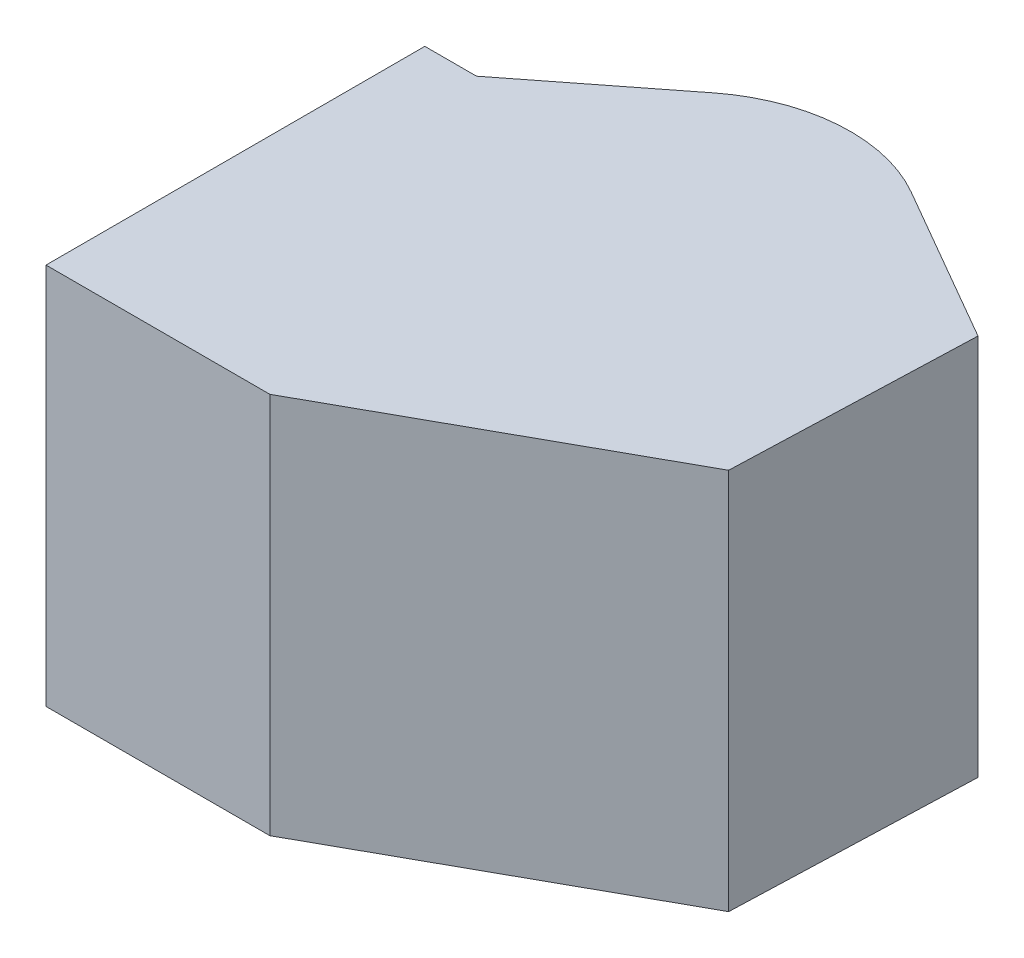
ISO-10303-21;
HEADER;
FILE_DESCRIPTION(('STEP AP214'),'2;1');
FILE_NAME('part.step','',(''),(''),'','','');
FILE_SCHEMA(('AUTOMOTIVE_DESIGN { 1 0 10303 214 1 1 1 1 }'));
ENDSEC;
DATA;
#1=APPLICATION_CONTEXT('core data for automotive mechanical design processes');
#2=APPLICATION_PROTOCOL_DEFINITION('international standard','automotive_design',2000,#1);
#3=PRODUCT_CONTEXT('',#1,'mechanical');
#4=PRODUCT('Part','Part','',(#3));
#5=PRODUCT_RELATED_PRODUCT_CATEGORY('part','',(#4));
#6=PRODUCT_DEFINITION_FORMATION('','',#4);
#7=PRODUCT_DEFINITION_CONTEXT('part definition',#1,'design');
#8=PRODUCT_DEFINITION('design','',#6,#7);
#9=PRODUCT_DEFINITION_SHAPE('','',#8);
#10=(LENGTH_UNIT() NAMED_UNIT(*) SI_UNIT(.MILLI.,.METRE.));
#11=(NAMED_UNIT(*) PLANE_ANGLE_UNIT() SI_UNIT($,.RADIAN.));
#12=(NAMED_UNIT(*) SI_UNIT($,.STERADIAN.) SOLID_ANGLE_UNIT());
#13=UNCERTAINTY_MEASURE_WITH_UNIT(LENGTH_MEASURE(1.E-05),#10,'distance_accuracy_value','');
#14=(GEOMETRIC_REPRESENTATION_CONTEXT(3) GLOBAL_UNCERTAINTY_ASSIGNED_CONTEXT((#13)) GLOBAL_UNIT_ASSIGNED_CONTEXT((#10,
#11,#12)) REPRESENTATION_CONTEXT('',''));
#15=CARTESIAN_POINT('',(0.,0.,0.));
#16=DIRECTION('',(0.,0.,1.));
#17=DIRECTION('',(1.,0.,0.));
#18=AXIS2_PLACEMENT_3D('',#15,#16,#17);
#19=CARTESIAN_POINT('',(-83.2176409176913,-55.5,55.));
#20=DIRECTION('',(-1.,0.,0.));
#21=DIRECTION('',(0.,0.,1.));
#22=AXIS2_PLACEMENT_3D('',#19,#20,#21);
#23=PLANE('',#22);
#24=CARTESIAN_POINT('',(-83.2176409176913,0.,0.));
#25=DIRECTION('',(-1.,0.,0.));
#26=DIRECTION('',(0.,0.,1.));
#27=AXIS2_PLACEMENT_3D('',#24,#25,#26);
#28=CIRCLE('',#27,48.);
#29=CARTESIAN_POINT('',(-83.2176409176913,0.,48.));
#30=VERTEX_POINT('',#29);
#31=EDGE_CURVE('E11',#30,#30,#28,.F.);
#32=ORIENTED_EDGE('',*,*,#31,.T.);
#33=EDGE_LOOP('',(#32));
#34=FACE_BOUND('',#33,.T.);
#35=DIRECTION('',(0.,1.,0.));
#36=VECTOR('',#35,1.);
#37=CARTESIAN_POINT('',(-83.2176409176913,-55.5,55.));
#38=LINE('',#37,#36);
#39=CARTESIAN_POINT('',(-83.2176409176913,-55.5,55.));
#40=VERTEX_POINT('',#39);
#41=CARTESIAN_POINT('',(-83.2176409176913,55.5,55.));
#42=VERTEX_POINT('',#41);
#43=EDGE_CURVE('E96',#40,#42,#38,.T.);
#44=ORIENTED_EDGE('',*,*,#43,.T.);
#45=DIRECTION('',(0.,0.,1.));
#46=VECTOR('',#45,1.);
#47=CARTESIAN_POINT('',(-83.2176409176913,55.5,55.));
#48=LINE('',#47,#46);
#49=CARTESIAN_POINT('',(-83.2176409176913,55.5,-55.));
#50=VERTEX_POINT('',#49);
#51=EDGE_CURVE('E99',#50,#42,#48,.T.);
#52=ORIENTED_EDGE('',*,*,#51,.F.);
#53=DIRECTION('',(0.,1.,0.));
#54=VECTOR('',#53,1.);
#55=CARTESIAN_POINT('',(-83.2176409176913,-55.5,-55.));
#56=LINE('',#55,#54);
#57=CARTESIAN_POINT('',(-83.2176409176913,-55.5,-55.));
#58=VERTEX_POINT('',#57);
#59=EDGE_CURVE('E47',#58,#50,#56,.T.);
#60=ORIENTED_EDGE('',*,*,#59,.F.);
#61=DIRECTION('',(0.,0.,1.));
#62=VECTOR('',#61,1.);
#63=CARTESIAN_POINT('',(-83.2176409176913,-55.5,55.));
#64=LINE('',#63,#62);
#65=EDGE_CURVE('E100',#58,#40,#64,.T.);
#66=ORIENTED_EDGE('',*,*,#65,.T.);
#67=EDGE_LOOP('',(#44,#52,#60,#66));
#68=FACE_BOUND('',#67,.T.);
#69=ADVANCED_FACE('F32',(#34,#68),#23,.T.);
#70=CARTESIAN_POINT('',(-83.2176409176913,-55.5,-55.));
#71=DIRECTION('',(0.,0.,-1.));
#72=DIRECTION('',(-1.,0.,0.));
#73=AXIS2_PLACEMENT_3D('',#70,#71,#72);
#74=PLANE('',#73);
#75=ORIENTED_EDGE('',*,*,#59,.T.);
#76=DIRECTION('',(-1.,0.,0.));
#77=VECTOR('',#76,1.);
#78=CARTESIAN_POINT('',(-83.2176409176913,55.5,-55.));
#79=LINE('',#78,#77);
#80=CARTESIAN_POINT('',(-68.2176409176913,55.5,-55.));
#81=VERTEX_POINT('',#80);
#82=EDGE_CURVE('E118',#81,#50,#79,.T.);
#83=ORIENTED_EDGE('',*,*,#82,.F.);
#84=DIRECTION('',(0.,1.,0.));
#85=VECTOR('',#84,1.);
#86=CARTESIAN_POINT('',(-68.2176409176913,-55.5,-55.));
#87=LINE('',#86,#85);
#88=CARTESIAN_POINT('',(-68.2176409176913,-55.5,-55.));
#89=VERTEX_POINT('',#88);
#90=EDGE_CURVE('E55',#89,#81,#87,.T.);
#91=ORIENTED_EDGE('',*,*,#90,.F.);
#92=DIRECTION('',(-1.,0.,0.));
#93=VECTOR('',#92,1.);
#94=CARTESIAN_POINT('',(-83.2176409176913,-55.5,-55.));
#95=LINE('',#94,#93);
#96=EDGE_CURVE('E105',#89,#58,#95,.T.);
#97=ORIENTED_EDGE('',*,*,#96,.T.);
#98=EDGE_LOOP('',(#75,#83,#91,#97));
#99=FACE_BOUND('',#98,.T.);
#100=ADVANCED_FACE('F181',(#99),#74,.T.);
#101=CARTESIAN_POINT('',(-68.2176409176913,-55.5,-55.));
#102=DIRECTION('',(-0.616245202756183,0.,-0.787554347381811));
#103=DIRECTION('',(-0.787554347381811,0.,0.616245202756184));
#104=AXIS2_PLACEMENT_3D('',#101,#102,#103);
#105=PLANE('',#104);
#106=ORIENTED_EDGE('',*,*,#90,.T.);
#107=DIRECTION('',(-0.787554347381811,0.,0.616245202756184));
#108=VECTOR('',#107,1.);
#109=CARTESIAN_POINT('',(-68.2176409176913,55.5,-55.));
#110=LINE('',#109,#108);
#111=CARTESIAN_POINT('',(-29.6274778959825,55.5,-85.196014935053));
#112=VERTEX_POINT('',#111);
#113=EDGE_CURVE('E134',#112,#81,#110,.T.);
#114=ORIENTED_EDGE('',*,*,#113,.F.);
#115=DIRECTION('',(0.,1.,0.));
#116=VECTOR('',#115,1.);
#117=CARTESIAN_POINT('',(-29.6274778959825,-55.5,-85.196014935053));
#118=LINE('',#117,#116);
#119=CARTESIAN_POINT('',(-29.6274778959825,-55.5,-85.196014935053));
#120=VERTEX_POINT('',#119);
#121=EDGE_CURVE('E157',#120,#112,#118,.T.);
#122=ORIENTED_EDGE('',*,*,#121,.F.);
#123=DIRECTION('',(-0.787554347381811,0.,0.616245202756184));
#124=VECTOR('',#123,1.);
#125=CARTESIAN_POINT('',(-68.2176409176913,-55.5,-55.));
#126=LINE('',#125,#124);
#127=EDGE_CURVE('E152',#120,#89,#126,.T.);
#128=ORIENTED_EDGE('',*,*,#127,.T.);
#129=EDGE_LOOP('',(#106,#114,#122,#128));
#130=FACE_BOUND('',#129,.T.);
#131=ADVANCED_FACE('F186',(#130),#105,.T.);
#132=CARTESIAN_POINT('',(0.,-55.5,-47.3324357711412));
#133=DIRECTION('',(0.,1.,0.));
#134=DIRECTION('',(0.,0.,1.));
#135=AXIS2_PLACEMENT_3D('',#132,#133,#134);
#136=CYLINDRICAL_SURFACE('',#135,48.0774175011382);
#137=ORIENTED_EDGE('',*,*,#121,.T.);
#138=CARTESIAN_POINT('',(0.,55.5,-47.3324357711412));
#139=DIRECTION('',(0.,1.,0.));
#140=DIRECTION('',(0.,0.,1.));
#141=AXIS2_PLACEMENT_3D('',#138,#139,#140);
#142=CIRCLE('',#141,48.0774175011382);
#143=CARTESIAN_POINT('',(24.0387087505688,55.5,-88.9687006754776));
#144=VERTEX_POINT('',#143);
#145=EDGE_CURVE('E131',#144,#112,#142,.T.);
#146=ORIENTED_EDGE('',*,*,#145,.F.);
#147=DIRECTION('',(0.,1.,0.));
#148=VECTOR('',#147,1.);
#149=CARTESIAN_POINT('',(24.0387087505688,-55.5,-88.9687006754776));
#150=LINE('',#149,#148);
#151=CARTESIAN_POINT('',(24.0387087505688,-55.5,-88.9687006754776));
#152=VERTEX_POINT('',#151);
#153=EDGE_CURVE('E159',#152,#144,#150,.T.);
#154=ORIENTED_EDGE('',*,*,#153,.F.);
#155=CARTESIAN_POINT('',(0.,-55.5,-47.3324357711412));
#156=DIRECTION('',(0.,1.,0.));
#157=DIRECTION('',(0.,0.,1.));
#158=AXIS2_PLACEMENT_3D('',#155,#156,#157);
#159=CIRCLE('',#158,48.0774175011382);
#160=EDGE_CURVE('E149',#152,#120,#159,.T.);
#161=ORIENTED_EDGE('',*,*,#160,.T.);
#162=EDGE_LOOP('',(#137,#146,#154,#161));
#163=FACE_BOUND('',#162,.T.);
#164=ADVANCED_FACE('F203',(#163),#136,.T.);
#165=CARTESIAN_POINT('',(69.9380551511442,-55.5,-62.4687006754779));
#166=DIRECTION('',(0.499999999999994,0.,-0.866025403784442));
#167=DIRECTION('',(-0.866025403784442,0.,-0.499999999999995));
#168=AXIS2_PLACEMENT_3D('',#165,#166,#167);
#169=PLANE('',#168);
#170=ORIENTED_EDGE('',*,*,#153,.T.);
#171=DIRECTION('',(-0.866025403784442,0.,-0.499999999999994));
#172=VECTOR('',#171,1.);
#173=CARTESIAN_POINT('',(69.9380551511442,55.5,-62.4687006754779));
#174=LINE('',#173,#172);
#175=CARTESIAN_POINT('',(69.9380551511442,55.5,-62.4687006754779));
#176=VERTEX_POINT('',#175);
#177=EDGE_CURVE('E128',#176,#144,#174,.T.);
#178=ORIENTED_EDGE('',*,*,#177,.F.);
#179=DIRECTION('',(0.,1.,0.));
#180=VECTOR('',#179,1.);
#181=CARTESIAN_POINT('',(69.9380551511442,-55.5,-62.4687006754779));
#182=LINE('',#181,#180);
#183=CARTESIAN_POINT('',(69.9380551511442,-55.5,-62.4687006754779));
#184=VERTEX_POINT('',#183);
#185=EDGE_CURVE('E161',#184,#176,#182,.T.);
#186=ORIENTED_EDGE('',*,*,#185,.F.);
#187=DIRECTION('',(-0.866025403784442,0.,-0.499999999999994));
#188=VECTOR('',#187,1.);
#189=CARTESIAN_POINT('',(69.9380551511442,-55.5,-62.4687006754779));
#190=LINE('',#189,#188);
#191=EDGE_CURVE('E146',#184,#152,#190,.T.);
#192=ORIENTED_EDGE('',*,*,#191,.T.);
#193=EDGE_LOOP('',(#170,#178,#186,#192));
#194=FACE_BOUND('',#193,.T.);
#195=ADVANCED_FACE('F199',(#194),#169,.T.);
#196=CARTESIAN_POINT('',(67.4950903819694,-55.5,7.48865721585882));
#197=DIRECTION('',(0.999390827019096,0.,0.0348994967024967));
#198=DIRECTION('',(0.0348994967024967,0.,-0.999390827019096));
#199=AXIS2_PLACEMENT_3D('',#196,#197,#198);
#200=PLANE('',#199);
#201=ORIENTED_EDGE('',*,*,#185,.T.);
#202=DIRECTION('',(0.0348994967024967,0.,-0.999390827019096));
#203=VECTOR('',#202,1.);
#204=CARTESIAN_POINT('',(67.4950903819694,55.5,7.48865721585882));
#205=LINE('',#204,#203);
#206=CARTESIAN_POINT('',(67.4950903819694,55.5,7.48865721585882));
#207=VERTEX_POINT('',#206);
#208=EDGE_CURVE('E125',#207,#176,#205,.T.);
#209=ORIENTED_EDGE('',*,*,#208,.F.);
#210=DIRECTION('',(0.,1.,0.));
#211=VECTOR('',#210,1.);
#212=CARTESIAN_POINT('',(67.4950903819694,-55.5,7.48865721585882));
#213=LINE('',#212,#211);
#214=CARTESIAN_POINT('',(67.4950903819694,-55.5,7.48865721585882));
#215=VERTEX_POINT('',#214);
#216=EDGE_CURVE('E163',#215,#207,#213,.T.);
#217=ORIENTED_EDGE('',*,*,#216,.F.);
#218=DIRECTION('',(0.0348994967024967,0.,-0.999390827019096));
#219=VECTOR('',#218,1.);
#220=CARTESIAN_POINT('',(67.4950903819694,-55.5,7.48865721585882));
#221=LINE('',#220,#219);
#222=EDGE_CURVE('E143',#215,#184,#221,.T.);
#223=ORIENTED_EDGE('',*,*,#222,.T.);
#224=EDGE_LOOP('',(#201,#209,#217,#223));
#225=FACE_BOUND('',#224,.T.);
#226=ADVANCED_FACE('F195',(#225),#200,.T.);
#227=CARTESIAN_POINT('',(-18.2176409176913,-55.5,55.));
#228=DIRECTION('',(0.484809620246338,0.,0.874619707139395));
#229=DIRECTION('',(0.874619707139395,0.,-0.484809620246338));
#230=AXIS2_PLACEMENT_3D('',#227,#228,#229);
#231=PLANE('',#230);
#232=ORIENTED_EDGE('',*,*,#216,.T.);
#233=DIRECTION('',(0.874619707139395,0.,-0.484809620246338));
#234=VECTOR('',#233,1.);
#235=CARTESIAN_POINT('',(-18.2176409176913,55.5,55.));
#236=LINE('',#235,#234);
#237=CARTESIAN_POINT('',(-18.2176409176913,55.5,55.));
#238=VERTEX_POINT('',#237);
#239=EDGE_CURVE('E113',#238,#207,#236,.T.);
#240=ORIENTED_EDGE('',*,*,#239,.F.);
#241=DIRECTION('',(0.,1.,0.));
#242=VECTOR('',#241,1.);
#243=CARTESIAN_POINT('',(-18.2176409176913,-55.5,55.));
#244=LINE('',#243,#242);
#245=CARTESIAN_POINT('',(-18.2176409176913,-55.5,55.));
#246=VERTEX_POINT('',#245);
#247=EDGE_CURVE('E104',#246,#238,#244,.T.);
#248=ORIENTED_EDGE('',*,*,#247,.F.);
#249=DIRECTION('',(0.874619707139395,0.,-0.484809620246338));
#250=VECTOR('',#249,1.);
#251=CARTESIAN_POINT('',(-18.2176409176913,-55.5,55.));
#252=LINE('',#251,#250);
#253=EDGE_CURVE('E140',#246,#215,#252,.T.);
#254=ORIENTED_EDGE('',*,*,#253,.T.);
#255=EDGE_LOOP('',(#232,#240,#248,#254));
#256=FACE_BOUND('',#255,.T.);
#257=ADVANCED_FACE('F192',(#256),#231,.T.);
#258=CARTESIAN_POINT('',(-83.2176409176913,-55.5,55.));
#259=DIRECTION('',(0.,0.,1.));
#260=DIRECTION('',(1.,0.,0.));
#261=AXIS2_PLACEMENT_3D('',#258,#259,#260);
#262=PLANE('',#261);
#263=ORIENTED_EDGE('',*,*,#247,.T.);
#264=DIRECTION('',(1.,0.,0.));
#265=VECTOR('',#264,1.);
#266=CARTESIAN_POINT('',(-83.2176409176913,55.5,55.));
#267=LINE('',#266,#265);
#268=EDGE_CURVE('E108',#42,#238,#267,.T.);
#269=ORIENTED_EDGE('',*,*,#268,.F.);
#270=ORIENTED_EDGE('',*,*,#43,.F.);
#271=DIRECTION('',(1.,0.,0.));
#272=VECTOR('',#271,1.);
#273=CARTESIAN_POINT('',(-83.2176409176913,-55.5,55.));
#274=LINE('',#273,#272);
#275=EDGE_CURVE('E138',#40,#246,#274,.T.);
#276=ORIENTED_EDGE('',*,*,#275,.T.);
#277=EDGE_LOOP('',(#263,#269,#270,#276));
#278=FACE_BOUND('',#277,.T.);
#279=ADVANCED_FACE('F109',(#278),#262,.T.);
#280=CARTESIAN_POINT('',(0.,-55.5,-47.3324357711412));
#281=DIRECTION('',(0.,1.,0.));
#282=DIRECTION('',(0.,0.,1.));
#283=AXIS2_PLACEMENT_3D('',#280,#281,#282);
#284=PLANE('',#283);
#285=ORIENTED_EDGE('',*,*,#65,.F.);
#286=ORIENTED_EDGE('',*,*,#96,.F.);
#287=ORIENTED_EDGE('',*,*,#127,.F.);
#288=ORIENTED_EDGE('',*,*,#160,.F.);
#289=ORIENTED_EDGE('',*,*,#191,.F.);
#290=ORIENTED_EDGE('',*,*,#222,.F.);
#291=ORIENTED_EDGE('',*,*,#253,.F.);
#292=ORIENTED_EDGE('',*,*,#275,.F.);
#293=EDGE_LOOP('',(#285,#286,#287,#288,#289,#290,#291,#292));
#294=FACE_BOUND('',#293,.T.);
#295=ADVANCED_FACE('F191',(#294),#284,.F.);
#296=CARTESIAN_POINT('',(0.,55.5,-47.3324357711412));
#297=DIRECTION('',(0.,1.,0.));
#298=DIRECTION('',(0.,0.,1.));
#299=AXIS2_PLACEMENT_3D('',#296,#297,#298);
#300=PLANE('',#299);
#301=ORIENTED_EDGE('',*,*,#51,.T.);
#302=ORIENTED_EDGE('',*,*,#268,.T.);
#303=ORIENTED_EDGE('',*,*,#239,.T.);
#304=ORIENTED_EDGE('',*,*,#208,.T.);
#305=ORIENTED_EDGE('',*,*,#177,.T.);
#306=ORIENTED_EDGE('',*,*,#145,.T.);
#307=ORIENTED_EDGE('',*,*,#113,.T.);
#308=ORIENTED_EDGE('',*,*,#82,.T.);
#309=EDGE_LOOP('',(#301,#302,#303,#304,#305,#306,#307,#308));
#310=FACE_BOUND('',#309,.T.);
#311=ADVANCED_FACE('F116',(#310),#300,.T.);
#312=CARTESIAN_POINT('',(-93.2176409176913,0.,0.));
#313=DIRECTION('',(1.,0.,0.));
#314=DIRECTION('',(0.,0.,-1.));
#315=AXIS2_PLACEMENT_3D('',#312,#313,#314);
#316=CYLINDRICAL_SURFACE('',#315,45.);
#317=CARTESIAN_POINT('',(-86.2176409176913,0.,0.));
#318=DIRECTION('',(-1.,0.,0.));
#319=DIRECTION('',(0.,0.,1.));
#320=AXIS2_PLACEMENT_3D('',#317,#318,#319);
#321=CIRCLE('',#320,45.);
#322=CARTESIAN_POINT('',(-86.2176409176913,0.,45.));
#323=VERTEX_POINT('',#322);
#324=EDGE_CURVE('E40',#323,#323,#321,.T.);
#325=ORIENTED_EDGE('',*,*,#324,.T.);
#326=EDGE_LOOP('',(#325));
#327=FACE_BOUND('',#326,.T.);
#328=CARTESIAN_POINT('',(-93.2176409176913,0.,0.));
#329=DIRECTION('',(-1.,0.,0.));
#330=DIRECTION('',(0.,0.,1.));
#331=AXIS2_PLACEMENT_3D('',#328,#329,#330);
#332=CIRCLE('',#331,45.);
#333=CARTESIAN_POINT('',(-93.2176409176913,0.,45.));
#334=VERTEX_POINT('',#333);
#335=EDGE_CURVE('E119',#334,#334,#332,.T.);
#336=ORIENTED_EDGE('',*,*,#335,.F.);
#337=EDGE_LOOP('',(#336));
#338=FACE_BOUND('',#337,.T.);
#339=ADVANCED_FACE('F168',(#327,#338),#316,.T.);
#340=CARTESIAN_POINT('',(-93.2176409176913,0.,0.));
#341=DIRECTION('',(-1.,0.,0.));
#342=DIRECTION('',(0.,0.,1.));
#343=AXIS2_PLACEMENT_3D('',#340,#341,#342);
#344=PLANE('',#343);
#345=ORIENTED_EDGE('',*,*,#335,.T.);
#346=EDGE_LOOP('',(#345));
#347=FACE_BOUND('',#346,.T.);
#348=ADVANCED_FACE('F172',(#347),#344,.T.);
#349=CARTESIAN_POINT('',(-86.2176409176913,0.,0.));
#350=DIRECTION('',(-1.,0.,0.));
#351=DIRECTION('',(0.,0.,1.));
#352=AXIS2_PLACEMENT_3D('',#349,#350,#351);
#353=TOROIDAL_SURFACE('',#352,48.,3.);
#354=ORIENTED_EDGE('',*,*,#31,.F.);
#355=EDGE_LOOP('',(#354));
#356=FACE_BOUND('',#355,.T.);
#357=ORIENTED_EDGE('',*,*,#324,.F.);
#358=EDGE_LOOP('',(#357));
#359=FACE_BOUND('',#358,.T.);
#360=ADVANCED_FACE('F34',(#356,#359),#353,.F.);
#361=CLOSED_SHELL('',(#69,#100,#131,#164,#195,#226,#257,#279,#295,#311,#339,#348,#360));
#362=MANIFOLD_SOLID_BREP('B2',#361);
#363=ADVANCED_BREP_SHAPE_REPRESENTATION('',(#18,#362),#14);
#364=SHAPE_DEFINITION_REPRESENTATION(#9,#363);
ENDSEC;
END-ISO-10303-21;
